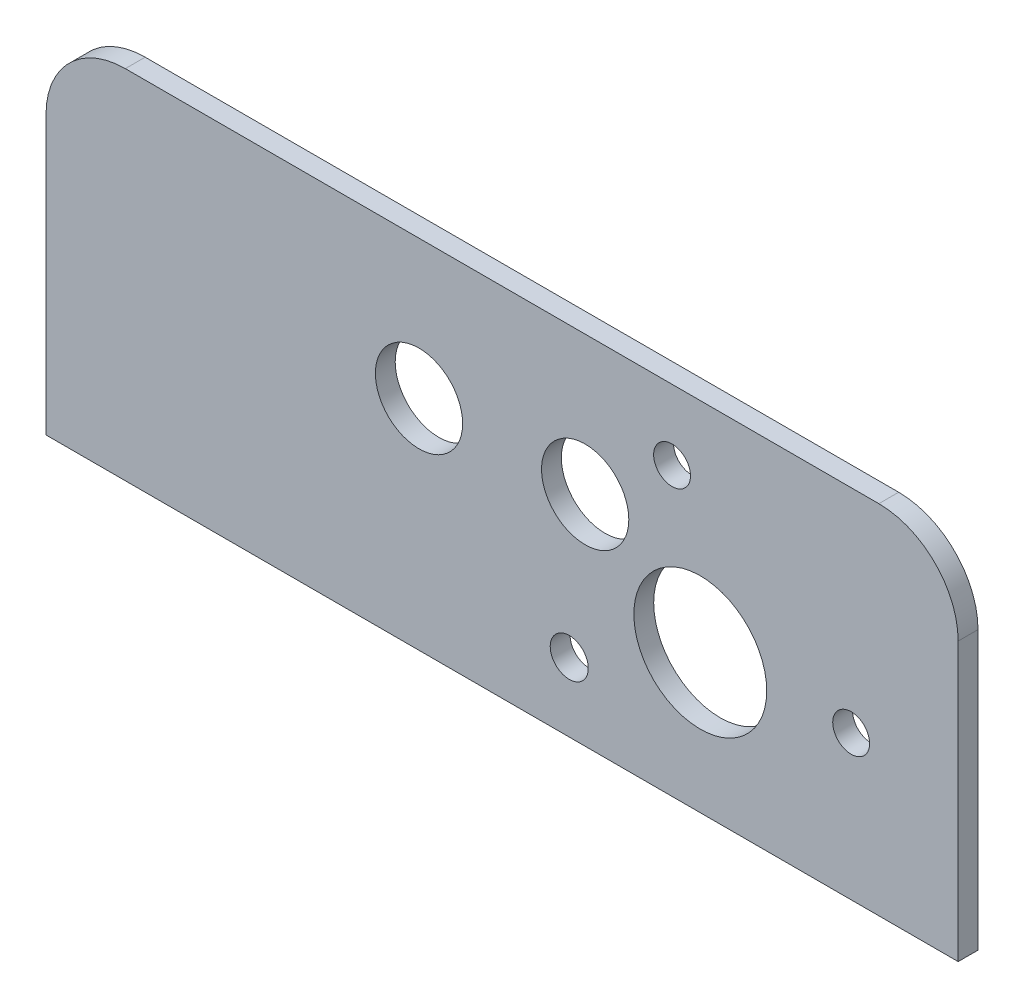
ISO-10303-21;
HEADER;
FILE_DESCRIPTION(('STEP AP214'),'2;1');
FILE_NAME('part.step','',(''),(''),'','','');
FILE_SCHEMA(('AUTOMOTIVE_DESIGN { 1 0 10303 214 1 1 1 1 }'));
ENDSEC;
DATA;
#1=APPLICATION_CONTEXT('core data for automotive mechanical design processes');
#2=APPLICATION_PROTOCOL_DEFINITION('international standard','automotive_design',2000,#1);
#3=PRODUCT_CONTEXT('',#1,'mechanical');
#4=PRODUCT('Part','Part','',(#3));
#5=PRODUCT_RELATED_PRODUCT_CATEGORY('part','',(#4));
#6=PRODUCT_DEFINITION_FORMATION('','',#4);
#7=PRODUCT_DEFINITION_CONTEXT('part definition',#1,'design');
#8=PRODUCT_DEFINITION('design','',#6,#7);
#9=PRODUCT_DEFINITION_SHAPE('','',#8);
#10=(LENGTH_UNIT() NAMED_UNIT(*) SI_UNIT(.MILLI.,.METRE.));
#11=(NAMED_UNIT(*) PLANE_ANGLE_UNIT() SI_UNIT($,.RADIAN.));
#12=(NAMED_UNIT(*) SI_UNIT($,.STERADIAN.) SOLID_ANGLE_UNIT());
#13=UNCERTAINTY_MEASURE_WITH_UNIT(LENGTH_MEASURE(1.E-05),#10,'distance_accuracy_value','');
#14=(GEOMETRIC_REPRESENTATION_CONTEXT(3) GLOBAL_UNCERTAINTY_ASSIGNED_CONTEXT((#13)) GLOBAL_UNIT_ASSIGNED_CONTEXT((#10,
#11,#12)) REPRESENTATION_CONTEXT('',''));
#15=CARTESIAN_POINT('',(0.,0.,0.));
#16=DIRECTION('',(0.,0.,1.));
#17=DIRECTION('',(1.,0.,0.));
#18=AXIS2_PLACEMENT_3D('',#15,#16,#17);
#19=CARTESIAN_POINT('',(115.,-45.,5.));
#20=DIRECTION('',(-1.,0.,0.));
#21=DIRECTION('',(0.,0.,1.));
#22=AXIS2_PLACEMENT_3D('',#19,#20,#21);
#23=PLANE('',#22);
#24=DIRECTION('',(0.,1.,0.));
#25=VECTOR('',#24,1.);
#26=CARTESIAN_POINT('',(115.,-45.,0.));
#27=LINE('',#26,#25);
#28=CARTESIAN_POINT('',(115.,-45.,0.));
#29=VERTEX_POINT('',#28);
#30=CARTESIAN_POINT('',(115.,25.,0.));
#31=VERTEX_POINT('',#30);
#32=EDGE_CURVE('E123',#29,#31,#27,.T.);
#33=ORIENTED_EDGE('',*,*,#32,.T.);
#34=DIRECTION('',(0.,0.,-1.));
#35=VECTOR('',#34,1.);
#36=CARTESIAN_POINT('',(115.,25.,5.));
#37=LINE('',#36,#35);
#38=CARTESIAN_POINT('',(115.,25.,5.));
#39=VERTEX_POINT('',#38);
#40=EDGE_CURVE('E63',#31,#39,#37,.F.);
#41=ORIENTED_EDGE('',*,*,#40,.T.);
#42=DIRECTION('',(0.,1.,0.));
#43=VECTOR('',#42,1.);
#44=CARTESIAN_POINT('',(115.,-45.,5.));
#45=LINE('',#44,#43);
#46=CARTESIAN_POINT('',(115.,-45.,5.));
#47=VERTEX_POINT('',#46);
#48=EDGE_CURVE('E135',#47,#39,#45,.T.);
#49=ORIENTED_EDGE('',*,*,#48,.F.);
#50=DIRECTION('',(0.,0.,-1.));
#51=VECTOR('',#50,1.);
#52=CARTESIAN_POINT('',(115.,-45.,5.));
#53=LINE('',#52,#51);
#54=EDGE_CURVE('E113',#47,#29,#53,.T.);
#55=ORIENTED_EDGE('',*,*,#54,.T.);
#56=EDGE_LOOP('',(#33,#41,#49,#55));
#57=FACE_BOUND('',#56,.T.);
#58=ADVANCED_FACE('F39',(#57),#23,.F.);
#59=CARTESIAN_POINT('',(-115.,45.,5.));
#60=DIRECTION('',(0.,-1.,0.));
#61=DIRECTION('',(0.,0.,-1.));
#62=AXIS2_PLACEMENT_3D('',#59,#60,#61);
#63=PLANE('',#62);
#64=DIRECTION('',(-1.,0.,0.));
#65=VECTOR('',#64,1.);
#66=CARTESIAN_POINT('',(-115.,45.,5.));
#67=LINE('',#66,#65);
#68=CARTESIAN_POINT('',(95.,45.,5.));
#69=VERTEX_POINT('',#68);
#70=CARTESIAN_POINT('',(-95.,45.,5.));
#71=VERTEX_POINT('',#70);
#72=EDGE_CURVE('E102',#69,#71,#67,.T.);
#73=ORIENTED_EDGE('',*,*,#72,.F.);
#74=DIRECTION('',(0.,0.,-1.));
#75=VECTOR('',#74,1.);
#76=CARTESIAN_POINT('',(95.,45.,5.));
#77=LINE('',#76,#75);
#78=CARTESIAN_POINT('',(95.,45.,0.));
#79=VERTEX_POINT('',#78);
#80=EDGE_CURVE('E139',#69,#79,#77,.T.);
#81=ORIENTED_EDGE('',*,*,#80,.T.);
#82=DIRECTION('',(-1.,0.,0.));
#83=VECTOR('',#82,1.);
#84=CARTESIAN_POINT('',(-115.,45.,0.));
#85=LINE('',#84,#83);
#86=CARTESIAN_POINT('',(-95.,45.,0.));
#87=VERTEX_POINT('',#86);
#88=EDGE_CURVE('E126',#79,#87,#85,.T.);
#89=ORIENTED_EDGE('',*,*,#88,.T.);
#90=DIRECTION('',(0.,0.,-1.));
#91=VECTOR('',#90,1.);
#92=CARTESIAN_POINT('',(-95.,45.,5.));
#93=LINE('',#92,#91);
#94=EDGE_CURVE('E112',#87,#71,#93,.F.);
#95=ORIENTED_EDGE('',*,*,#94,.T.);
#96=EDGE_LOOP('',(#73,#81,#89,#95));
#97=FACE_BOUND('',#96,.T.);
#98=ADVANCED_FACE('F158',(#97),#63,.F.);
#99=CARTESIAN_POINT('',(-115.,-45.,5.));
#100=DIRECTION('',(1.,0.,0.));
#101=DIRECTION('',(0.,0.,-1.));
#102=AXIS2_PLACEMENT_3D('',#99,#100,#101);
#103=PLANE('',#102);
#104=DIRECTION('',(0.,-1.,0.));
#105=VECTOR('',#104,1.);
#106=CARTESIAN_POINT('',(-115.,-45.,5.));
#107=LINE('',#106,#105);
#108=CARTESIAN_POINT('',(-115.,25.,5.));
#109=VERTEX_POINT('',#108);
#110=CARTESIAN_POINT('',(-115.,-45.,5.));
#111=VERTEX_POINT('',#110);
#112=EDGE_CURVE('E93',#109,#111,#107,.T.);
#113=ORIENTED_EDGE('',*,*,#112,.F.);
#114=DIRECTION('',(0.,0.,-1.));
#115=VECTOR('',#114,1.);
#116=CARTESIAN_POINT('',(-115.,25.,5.));
#117=LINE('',#116,#115);
#118=CARTESIAN_POINT('',(-115.,25.,0.));
#119=VERTEX_POINT('',#118);
#120=EDGE_CURVE('E11',#109,#119,#117,.T.);
#121=ORIENTED_EDGE('',*,*,#120,.T.);
#122=DIRECTION('',(0.,-1.,0.));
#123=VECTOR('',#122,1.);
#124=CARTESIAN_POINT('',(-115.,-45.,0.));
#125=LINE('',#124,#123);
#126=CARTESIAN_POINT('',(-115.,-45.,0.));
#127=VERTEX_POINT('',#126);
#128=EDGE_CURVE('E108',#119,#127,#125,.T.);
#129=ORIENTED_EDGE('',*,*,#128,.T.);
#130=DIRECTION('',(0.,0.,-1.));
#131=VECTOR('',#130,1.);
#132=CARTESIAN_POINT('',(-115.,-45.,5.));
#133=LINE('',#132,#131);
#134=EDGE_CURVE('E105',#111,#127,#133,.T.);
#135=ORIENTED_EDGE('',*,*,#134,.F.);
#136=EDGE_LOOP('',(#113,#121,#129,#135));
#137=FACE_BOUND('',#136,.T.);
#138=ADVANCED_FACE('F106',(#137),#103,.F.);
#139=CARTESIAN_POINT('',(-115.,-45.,5.));
#140=DIRECTION('',(0.,1.,0.));
#141=DIRECTION('',(0.,0.,1.));
#142=AXIS2_PLACEMENT_3D('',#139,#140,#141);
#143=PLANE('',#142);
#144=DIRECTION('',(1.,0.,0.));
#145=VECTOR('',#144,1.);
#146=CARTESIAN_POINT('',(-115.,-45.,0.));
#147=LINE('',#146,#145);
#148=EDGE_CURVE('E133',#127,#29,#147,.T.);
#149=ORIENTED_EDGE('',*,*,#148,.T.);
#150=ORIENTED_EDGE('',*,*,#54,.F.);
#151=DIRECTION('',(1.,0.,0.));
#152=VECTOR('',#151,1.);
#153=CARTESIAN_POINT('',(-115.,-45.,5.));
#154=LINE('',#153,#152);
#155=EDGE_CURVE('E97',#111,#47,#154,.T.);
#156=ORIENTED_EDGE('',*,*,#155,.F.);
#157=ORIENTED_EDGE('',*,*,#134,.T.);
#158=EDGE_LOOP('',(#149,#150,#156,#157));
#159=FACE_BOUND('',#158,.T.);
#160=ADVANCED_FACE('F115',(#159),#143,.F.);
#161=CARTESIAN_POINT('',(0.,0.,5.));
#162=DIRECTION('',(0.,0.,-1.));
#163=DIRECTION('',(-1.,0.,0.));
#164=AXIS2_PLACEMENT_3D('',#161,#162,#163);
#165=PLANE('',#164);
#166=CARTESIAN_POINT('',(42.8614804843462,27.3152973818001,5.));
#167=DIRECTION('',(0.,0.,-1.));
#168=DIRECTION('',(-1.,0.,0.));
#169=AXIS2_PLACEMENT_3D('',#166,#167,#168);
#170=CIRCLE('',#169,4.650000000108);
#171=CARTESIAN_POINT('',(38.2114804842382,27.3152973818001,5.));
#172=VERTEX_POINT('',#171);
#173=EDGE_CURVE('E174',#172,#172,#170,.F.);
#174=ORIENTED_EDGE('',*,*,#173,.F.);
#175=EDGE_LOOP('',(#174));
#176=FACE_BOUND('',#175,.T.);
#177=CARTESIAN_POINT('',(88.0159189111197,-8.56030338717981,5.));
#178=DIRECTION('',(0.,0.,-1.));
#179=DIRECTION('',(-1.,0.,0.));
#180=AXIS2_PLACEMENT_3D('',#177,#178,#179);
#181=CIRCLE('',#180,4.65000000010797);
#182=CARTESIAN_POINT('',(83.3659189110117,-8.56030338717981,5.));
#183=VERTEX_POINT('',#182);
#184=EDGE_CURVE('E202',#183,#183,#181,.F.);
#185=ORIENTED_EDGE('',*,*,#184,.F.);
#186=EDGE_LOOP('',(#185));
#187=FACE_BOUND('',#186,.T.);
#188=CARTESIAN_POINT('',(16.9351967229203,-27.6044468849209,5.));
#189=DIRECTION('',(0.,0.,-1.));
#190=DIRECTION('',(-1.,0.,0.));
#191=AXIS2_PLACEMENT_3D('',#188,#189,#190);
#192=CIRCLE('',#191,4.800000000108);
#193=CARTESIAN_POINT('',(12.1351967228123,-27.6044468849209,5.));
#194=VERTEX_POINT('',#193);
#195=EDGE_CURVE('E193',#194,#194,#192,.F.);
#196=ORIENTED_EDGE('',*,*,#195,.F.);
#197=EDGE_LOOP('',(#196));
#198=FACE_BOUND('',#197,.T.);
#199=CARTESIAN_POINT('',(-20.95,10.,5.));
#200=DIRECTION('',(0.,0.,1.));
#201=DIRECTION('',(1.,0.,0.));
#202=AXIS2_PLACEMENT_3D('',#199,#200,#201);
#203=CIRCLE('',#202,11.);
#204=CARTESIAN_POINT('',(-9.95,10.,5.));
#205=VERTEX_POINT('',#204);
#206=EDGE_CURVE('E127',#205,#205,#203,.T.);
#207=ORIENTED_EDGE('',*,*,#206,.F.);
#208=EDGE_LOOP('',(#207));
#209=FACE_BOUND('',#208,.T.);
#210=CARTESIAN_POINT('',(20.95,10.,5.));
#211=DIRECTION('',(0.,0.,1.));
#212=DIRECTION('',(1.,0.,0.));
#213=AXIS2_PLACEMENT_3D('',#210,#211,#212);
#214=CIRCLE('',#213,11.);
#215=CARTESIAN_POINT('',(31.95,10.,5.));
#216=VERTEX_POINT('',#215);
#217=EDGE_CURVE('E182',#216,#216,#214,.T.);
#218=ORIENTED_EDGE('',*,*,#217,.F.);
#219=EDGE_LOOP('',(#218));
#220=FACE_BOUND('',#219,.T.);
#221=CARTESIAN_POINT('',(49.9769271539376,-10.,5.));
#222=DIRECTION('',(0.,0.,1.));
#223=DIRECTION('',(1.,0.,0.));
#224=AXIS2_PLACEMENT_3D('',#221,#222,#223);
#225=CIRCLE('',#224,16.75);
#226=CARTESIAN_POINT('',(66.7269271539376,-10.,5.));
#227=VERTEX_POINT('',#226);
#228=EDGE_CURVE('E173',#227,#227,#225,.T.);
#229=ORIENTED_EDGE('',*,*,#228,.F.);
#230=EDGE_LOOP('',(#229));
#231=FACE_BOUND('',#230,.T.);
#232=ORIENTED_EDGE('',*,*,#48,.T.);
#233=CARTESIAN_POINT('',(95.,25.,5.));
#234=DIRECTION('',(0.,0.,-1.));
#235=DIRECTION('',(-1.,0.,0.));
#236=AXIS2_PLACEMENT_3D('',#233,#234,#235);
#237=CIRCLE('',#236,20.);
#238=EDGE_CURVE('E48',#39,#69,#237,.F.);
#239=ORIENTED_EDGE('',*,*,#238,.T.);
#240=ORIENTED_EDGE('',*,*,#72,.T.);
#241=CARTESIAN_POINT('',(-95.,25.,5.));
#242=DIRECTION('',(0.,0.,-1.));
#243=DIRECTION('',(-1.,0.,0.));
#244=AXIS2_PLACEMENT_3D('',#241,#242,#243);
#245=CIRCLE('',#244,20.);
#246=EDGE_CURVE('E55',#71,#109,#245,.F.);
#247=ORIENTED_EDGE('',*,*,#246,.T.);
#248=ORIENTED_EDGE('',*,*,#112,.T.);
#249=ORIENTED_EDGE('',*,*,#155,.T.);
#250=EDGE_LOOP('',(#232,#239,#240,#247,#248,#249));
#251=FACE_BOUND('',#250,.T.);
#252=ADVANCED_FACE('F95',(#176,#187,#198,#209,#220,#231,#251),#165,.F.);
#253=CARTESIAN_POINT('',(0.,0.,0.));
#254=DIRECTION('',(0.,0.,-1.));
#255=DIRECTION('',(-1.,0.,0.));
#256=AXIS2_PLACEMENT_3D('',#253,#254,#255);
#257=PLANE('',#256);
#258=CARTESIAN_POINT('',(42.8614804843462,27.3152973818001,0.));
#259=DIRECTION('',(0.,0.,-1.));
#260=DIRECTION('',(-1.,0.,0.));
#261=AXIS2_PLACEMENT_3D('',#258,#259,#260);
#262=CIRCLE('',#261,4.650000000108);
#263=CARTESIAN_POINT('',(38.2114804842382,27.3152973818001,0.));
#264=VERTEX_POINT('',#263);
#265=EDGE_CURVE('E206',#264,#264,#262,.T.);
#266=ORIENTED_EDGE('',*,*,#265,.F.);
#267=EDGE_LOOP('',(#266));
#268=FACE_BOUND('',#267,.T.);
#269=CARTESIAN_POINT('',(88.0159189111197,-8.56030338717981,0.));
#270=DIRECTION('',(0.,0.,-1.));
#271=DIRECTION('',(-1.,0.,0.));
#272=AXIS2_PLACEMENT_3D('',#269,#270,#271);
#273=CIRCLE('',#272,4.65000000010797);
#274=CARTESIAN_POINT('',(83.3659189110117,-8.56030338717981,0.));
#275=VERTEX_POINT('',#274);
#276=EDGE_CURVE('E197',#275,#275,#273,.T.);
#277=ORIENTED_EDGE('',*,*,#276,.F.);
#278=EDGE_LOOP('',(#277));
#279=FACE_BOUND('',#278,.T.);
#280=CARTESIAN_POINT('',(16.9351967229203,-27.6044468849209,0.));
#281=DIRECTION('',(0.,0.,-1.));
#282=DIRECTION('',(-1.,0.,0.));
#283=AXIS2_PLACEMENT_3D('',#280,#281,#282);
#284=CIRCLE('',#283,4.800000000108);
#285=CARTESIAN_POINT('',(12.1351967228123,-27.6044468849209,0.));
#286=VERTEX_POINT('',#285);
#287=EDGE_CURVE('E198',#286,#286,#284,.T.);
#288=ORIENTED_EDGE('',*,*,#287,.F.);
#289=EDGE_LOOP('',(#288));
#290=FACE_BOUND('',#289,.T.);
#291=CARTESIAN_POINT('',(-20.95,10.,0.));
#292=DIRECTION('',(0.,0.,-1.));
#293=DIRECTION('',(-1.,0.,0.));
#294=AXIS2_PLACEMENT_3D('',#291,#292,#293);
#295=CIRCLE('',#294,11.);
#296=CARTESIAN_POINT('',(-31.95,10.,0.));
#297=VERTEX_POINT('',#296);
#298=EDGE_CURVE('E186',#297,#297,#295,.F.);
#299=ORIENTED_EDGE('',*,*,#298,.T.);
#300=EDGE_LOOP('',(#299));
#301=FACE_BOUND('',#300,.T.);
#302=CARTESIAN_POINT('',(20.95,10.,0.));
#303=DIRECTION('',(0.,0.,-1.));
#304=DIRECTION('',(-1.,0.,0.));
#305=AXIS2_PLACEMENT_3D('',#302,#303,#304);
#306=CIRCLE('',#305,11.);
#307=CARTESIAN_POINT('',(9.95,10.,0.));
#308=VERTEX_POINT('',#307);
#309=EDGE_CURVE('E178',#308,#308,#306,.F.);
#310=ORIENTED_EDGE('',*,*,#309,.T.);
#311=EDGE_LOOP('',(#310));
#312=FACE_BOUND('',#311,.T.);
#313=CARTESIAN_POINT('',(49.9769271539376,-10.,0.));
#314=DIRECTION('',(0.,0.,-1.));
#315=DIRECTION('',(-1.,0.,0.));
#316=AXIS2_PLACEMENT_3D('',#313,#314,#315);
#317=CIRCLE('',#316,16.75);
#318=CARTESIAN_POINT('',(33.2269271539376,-10.,0.));
#319=VERTEX_POINT('',#318);
#320=EDGE_CURVE('E169',#319,#319,#317,.F.);
#321=ORIENTED_EDGE('',*,*,#320,.T.);
#322=EDGE_LOOP('',(#321));
#323=FACE_BOUND('',#322,.T.);
#324=ORIENTED_EDGE('',*,*,#88,.F.);
#325=CARTESIAN_POINT('',(95.,25.,0.));
#326=DIRECTION('',(0.,0.,-1.));
#327=DIRECTION('',(-1.,0.,0.));
#328=AXIS2_PLACEMENT_3D('',#325,#326,#327);
#329=CIRCLE('',#328,20.);
#330=EDGE_CURVE('E146',#79,#31,#329,.T.);
#331=ORIENTED_EDGE('',*,*,#330,.T.);
#332=ORIENTED_EDGE('',*,*,#32,.F.);
#333=ORIENTED_EDGE('',*,*,#148,.F.);
#334=ORIENTED_EDGE('',*,*,#128,.F.);
#335=CARTESIAN_POINT('',(-95.,25.,0.));
#336=DIRECTION('',(0.,0.,-1.));
#337=DIRECTION('',(-1.,0.,0.));
#338=AXIS2_PLACEMENT_3D('',#335,#336,#337);
#339=CIRCLE('',#338,20.);
#340=EDGE_CURVE('E143',#119,#87,#339,.T.);
#341=ORIENTED_EDGE('',*,*,#340,.T.);
#342=EDGE_LOOP('',(#324,#331,#332,#333,#334,#341));
#343=FACE_BOUND('',#342,.T.);
#344=ADVANCED_FACE('F165',(#268,#279,#290,#301,#312,#323,#343),#257,.T.);
#345=CARTESIAN_POINT('',(95.,25.,5.));
#346=DIRECTION('',(0.,0.,-1.));
#347=DIRECTION('',(-1.,0.,0.));
#348=AXIS2_PLACEMENT_3D('',#345,#346,#347);
#349=CYLINDRICAL_SURFACE('',#348,20.);
#350=ORIENTED_EDGE('',*,*,#238,.F.);
#351=ORIENTED_EDGE('',*,*,#40,.F.);
#352=ORIENTED_EDGE('',*,*,#330,.F.);
#353=ORIENTED_EDGE('',*,*,#80,.F.);
#354=EDGE_LOOP('',(#350,#351,#352,#353));
#355=FACE_BOUND('',#354,.T.);
#356=ADVANCED_FACE('F162',(#355),#349,.T.);
#357=CARTESIAN_POINT('',(-95.,25.,5.));
#358=DIRECTION('',(0.,0.,-1.));
#359=DIRECTION('',(-1.,0.,0.));
#360=AXIS2_PLACEMENT_3D('',#357,#358,#359);
#361=CYLINDRICAL_SURFACE('',#360,20.);
#362=ORIENTED_EDGE('',*,*,#246,.F.);
#363=ORIENTED_EDGE('',*,*,#94,.F.);
#364=ORIENTED_EDGE('',*,*,#340,.F.);
#365=ORIENTED_EDGE('',*,*,#120,.F.);
#366=EDGE_LOOP('',(#362,#363,#364,#365));
#367=FACE_BOUND('',#366,.T.);
#368=ADVANCED_FACE('F41',(#367),#361,.T.);
#369=CARTESIAN_POINT('',(49.9769271539376,-10.,-0.00100000000000013));
#370=DIRECTION('',(0.,0.,1.));
#371=DIRECTION('',(1.,0.,0.));
#372=AXIS2_PLACEMENT_3D('',#369,#370,#371);
#373=CYLINDRICAL_SURFACE('',#372,16.75);
#374=ORIENTED_EDGE('',*,*,#320,.F.);
#375=EDGE_LOOP('',(#374));
#376=FACE_BOUND('',#375,.T.);
#377=ORIENTED_EDGE('',*,*,#228,.T.);
#378=EDGE_LOOP('',(#377));
#379=FACE_BOUND('',#378,.T.);
#380=ADVANCED_FACE('F233',(#376,#379),#373,.F.);
#381=CARTESIAN_POINT('',(20.95,10.,-0.00100000000000013));
#382=DIRECTION('',(0.,0.,1.));
#383=DIRECTION('',(1.,0.,0.));
#384=AXIS2_PLACEMENT_3D('',#381,#382,#383);
#385=CYLINDRICAL_SURFACE('',#384,11.);
#386=ORIENTED_EDGE('',*,*,#309,.F.);
#387=EDGE_LOOP('',(#386));
#388=FACE_BOUND('',#387,.T.);
#389=ORIENTED_EDGE('',*,*,#217,.T.);
#390=EDGE_LOOP('',(#389));
#391=FACE_BOUND('',#390,.T.);
#392=ADVANCED_FACE('F236',(#388,#391),#385,.F.);
#393=CARTESIAN_POINT('',(-20.95,10.,-0.00100000000000013));
#394=DIRECTION('',(0.,0.,1.));
#395=DIRECTION('',(1.,0.,0.));
#396=AXIS2_PLACEMENT_3D('',#393,#394,#395);
#397=CYLINDRICAL_SURFACE('',#396,11.);
#398=ORIENTED_EDGE('',*,*,#298,.F.);
#399=EDGE_LOOP('',(#398));
#400=FACE_BOUND('',#399,.T.);
#401=ORIENTED_EDGE('',*,*,#206,.T.);
#402=EDGE_LOOP('',(#401));
#403=FACE_BOUND('',#402,.T.);
#404=ADVANCED_FACE('F273',(#400,#403),#397,.F.);
#405=CARTESIAN_POINT('',(16.9351967229203,-27.6044468849209,5.001));
#406=DIRECTION('',(0.,0.,-1.));
#407=DIRECTION('',(-1.,0.,0.));
#408=AXIS2_PLACEMENT_3D('',#405,#406,#407);
#409=CYLINDRICAL_SURFACE('',#408,4.800000000108);
#410=ORIENTED_EDGE('',*,*,#287,.T.);
#411=EDGE_LOOP('',(#410));
#412=FACE_BOUND('',#411,.T.);
#413=ORIENTED_EDGE('',*,*,#195,.T.);
#414=EDGE_LOOP('',(#413));
#415=FACE_BOUND('',#414,.T.);
#416=ADVANCED_FACE('F281',(#412,#415),#409,.F.);
#417=CARTESIAN_POINT('',(88.0159189111197,-8.56030338717981,5.001));
#418=DIRECTION('',(0.,0.,-1.));
#419=DIRECTION('',(-1.,0.,0.));
#420=AXIS2_PLACEMENT_3D('',#417,#418,#419);
#421=CYLINDRICAL_SURFACE('',#420,4.65000000010797);
#422=ORIENTED_EDGE('',*,*,#276,.T.);
#423=EDGE_LOOP('',(#422));
#424=FACE_BOUND('',#423,.T.);
#425=ORIENTED_EDGE('',*,*,#184,.T.);
#426=EDGE_LOOP('',(#425));
#427=FACE_BOUND('',#426,.T.);
#428=ADVANCED_FACE('F289',(#424,#427),#421,.F.);
#429=CARTESIAN_POINT('',(42.8614804843462,27.3152973818001,5.001));
#430=DIRECTION('',(0.,0.,-1.));
#431=DIRECTION('',(-1.,0.,0.));
#432=AXIS2_PLACEMENT_3D('',#429,#430,#431);
#433=CYLINDRICAL_SURFACE('',#432,4.650000000108);
#434=ORIENTED_EDGE('',*,*,#265,.T.);
#435=EDGE_LOOP('',(#434));
#436=FACE_BOUND('',#435,.T.);
#437=ORIENTED_EDGE('',*,*,#173,.T.);
#438=EDGE_LOOP('',(#437));
#439=FACE_BOUND('',#438,.T.);
#440=ADVANCED_FACE('F217',(#436,#439),#433,.F.);
#441=CLOSED_SHELL('',(#58,#98,#138,#160,#252,#344,#356,#368,#380,#392,#404,#416,#428,#440));
#442=MANIFOLD_SOLID_BREP('B2',#441);
#443=ADVANCED_BREP_SHAPE_REPRESENTATION('',(#18,#442),#14);
#444=SHAPE_DEFINITION_REPRESENTATION(#9,#443);
ENDSEC;
END-ISO-10303-21;
